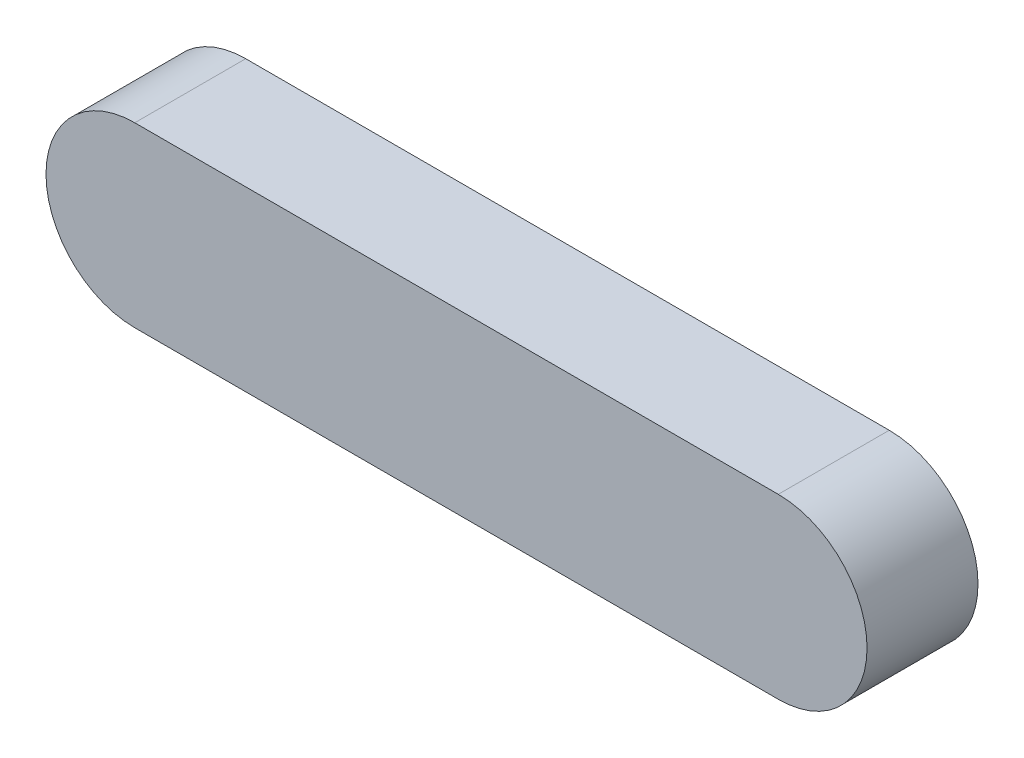
ISO-10303-21;
HEADER;
FILE_DESCRIPTION(('STEP AP214'),'2;1');
FILE_NAME('part.step','',(''),(''),'','','');
FILE_SCHEMA(('AUTOMOTIVE_DESIGN { 1 0 10303 214 1 1 1 1 }'));
ENDSEC;
DATA;
#1=APPLICATION_CONTEXT('core data for automotive mechanical design processes');
#2=APPLICATION_PROTOCOL_DEFINITION('international standard','automotive_design',2000,#1);
#3=PRODUCT_CONTEXT('',#1,'mechanical');
#4=PRODUCT('Part','Part','',(#3));
#5=PRODUCT_RELATED_PRODUCT_CATEGORY('part','',(#4));
#6=PRODUCT_DEFINITION_FORMATION('','',#4);
#7=PRODUCT_DEFINITION_CONTEXT('part definition',#1,'design');
#8=PRODUCT_DEFINITION('design','',#6,#7);
#9=PRODUCT_DEFINITION_SHAPE('','',#8);
#10=(LENGTH_UNIT() NAMED_UNIT(*) SI_UNIT(.MILLI.,.METRE.));
#11=(NAMED_UNIT(*) PLANE_ANGLE_UNIT() SI_UNIT($,.RADIAN.));
#12=(NAMED_UNIT(*) SI_UNIT($,.STERADIAN.) SOLID_ANGLE_UNIT());
#13=UNCERTAINTY_MEASURE_WITH_UNIT(LENGTH_MEASURE(1.E-05),#10,'distance_accuracy_value','');
#14=(GEOMETRIC_REPRESENTATION_CONTEXT(3) GLOBAL_UNCERTAINTY_ASSIGNED_CONTEXT((#13)) GLOBAL_UNIT_ASSIGNED_CONTEXT((#10,
#11,#12)) REPRESENTATION_CONTEXT('',''));
#15=CARTESIAN_POINT('',(0.,0.,0.));
#16=DIRECTION('',(0.,0.,1.));
#17=DIRECTION('',(1.,0.,0.));
#18=AXIS2_PLACEMENT_3D('',#15,#16,#17);
#19=CARTESIAN_POINT('',(0.,0.,10.));
#20=DIRECTION('',(0.,0.,-1.));
#21=DIRECTION('',(-1.,0.,0.));
#22=AXIS2_PLACEMENT_3D('',#19,#20,#21);
#23=CYLINDRICAL_SURFACE('',#22,8.);
#24=CARTESIAN_POINT('',(0.,0.,0.));
#25=DIRECTION('',(0.,0.,1.));
#26=DIRECTION('',(1.,0.,0.));
#27=AXIS2_PLACEMENT_3D('',#24,#25,#26);
#28=CIRCLE('',#27,8.);
#29=CARTESIAN_POINT('',(0.,8.,0.));
#30=VERTEX_POINT('',#29);
#31=CARTESIAN_POINT('',(0.,-8.,0.));
#32=VERTEX_POINT('',#31);
#33=EDGE_CURVE('E111',#30,#32,#28,.T.);
#34=ORIENTED_EDGE('',*,*,#33,.T.);
#35=DIRECTION('',(0.,0.,-1.));
#36=VECTOR('',#35,1.);
#37=CARTESIAN_POINT('',(0.,-8.,10.));
#38=LINE('',#37,#36);
#39=CARTESIAN_POINT('',(0.,-8.,10.));
#40=VERTEX_POINT('',#39);
#41=EDGE_CURVE('E11',#40,#32,#38,.T.);
#42=ORIENTED_EDGE('',*,*,#41,.F.);
#43=CARTESIAN_POINT('',(0.,0.,10.));
#44=DIRECTION('',(0.,0.,1.));
#45=DIRECTION('',(1.,0.,0.));
#46=AXIS2_PLACEMENT_3D('',#43,#44,#45);
#47=CIRCLE('',#46,8.);
#48=CARTESIAN_POINT('',(0.,8.,10.));
#49=VERTEX_POINT('',#48);
#50=EDGE_CURVE('E95',#49,#40,#47,.T.);
#51=ORIENTED_EDGE('',*,*,#50,.F.);
#52=DIRECTION('',(0.,0.,-1.));
#53=VECTOR('',#52,1.);
#54=CARTESIAN_POINT('',(0.,8.,10.));
#55=LINE('',#54,#53);
#56=EDGE_CURVE('E107',#49,#30,#55,.T.);
#57=ORIENTED_EDGE('',*,*,#56,.T.);
#58=EDGE_LOOP('',(#34,#42,#51,#57));
#59=FACE_BOUND('',#58,.T.);
#60=ADVANCED_FACE('F43',(#59),#23,.T.);
#61=CARTESIAN_POINT('',(0.,-8.,10.));
#62=DIRECTION('',(0.,1.,0.));
#63=DIRECTION('',(0.,0.,1.));
#64=AXIS2_PLACEMENT_3D('',#61,#62,#63);
#65=PLANE('',#64);
#66=DIRECTION('',(1.,0.,0.));
#67=VECTOR('',#66,1.);
#68=CARTESIAN_POINT('',(0.,-8.,0.));
#69=LINE('',#68,#67);
#70=CARTESIAN_POINT('',(58.,-8.,0.));
#71=VERTEX_POINT('',#70);
#72=EDGE_CURVE('E100',#32,#71,#69,.T.);
#73=ORIENTED_EDGE('',*,*,#72,.T.);
#74=DIRECTION('',(0.,0.,-1.));
#75=VECTOR('',#74,1.);
#76=CARTESIAN_POINT('',(58.,-8.,10.));
#77=LINE('',#76,#75);
#78=CARTESIAN_POINT('',(58.,-8.,10.));
#79=VERTEX_POINT('',#78);
#80=EDGE_CURVE('E52',#79,#71,#77,.T.);
#81=ORIENTED_EDGE('',*,*,#80,.F.);
#82=DIRECTION('',(1.,0.,0.));
#83=VECTOR('',#82,1.);
#84=CARTESIAN_POINT('',(0.,-8.,10.));
#85=LINE('',#84,#83);
#86=EDGE_CURVE('E90',#40,#79,#85,.T.);
#87=ORIENTED_EDGE('',*,*,#86,.F.);
#88=ORIENTED_EDGE('',*,*,#41,.T.);
#89=EDGE_LOOP('',(#73,#81,#87,#88));
#90=FACE_BOUND('',#89,.T.);
#91=ADVANCED_FACE('F99',(#90),#65,.F.);
#92=CARTESIAN_POINT('',(58.,0.,10.));
#93=DIRECTION('',(0.,0.,-1.));
#94=DIRECTION('',(-1.,0.,0.));
#95=AXIS2_PLACEMENT_3D('',#92,#93,#94);
#96=CYLINDRICAL_SURFACE('',#95,8.);
#97=CARTESIAN_POINT('',(58.,0.,0.));
#98=DIRECTION('',(0.,0.,1.));
#99=DIRECTION('',(1.,0.,0.));
#100=AXIS2_PLACEMENT_3D('',#97,#98,#99);
#101=CIRCLE('',#100,8.);
#102=CARTESIAN_POINT('',(58.,8.,0.));
#103=VERTEX_POINT('',#102);
#104=EDGE_CURVE('E77',#71,#103,#101,.T.);
#105=ORIENTED_EDGE('',*,*,#104,.T.);
#106=DIRECTION('',(0.,0.,-1.));
#107=VECTOR('',#106,1.);
#108=CARTESIAN_POINT('',(58.,8.,10.));
#109=LINE('',#108,#107);
#110=CARTESIAN_POINT('',(58.,8.,10.));
#111=VERTEX_POINT('',#110);
#112=EDGE_CURVE('E102',#111,#103,#109,.T.);
#113=ORIENTED_EDGE('',*,*,#112,.F.);
#114=CARTESIAN_POINT('',(58.,0.,10.));
#115=DIRECTION('',(0.,0.,1.));
#116=DIRECTION('',(1.,0.,0.));
#117=AXIS2_PLACEMENT_3D('',#114,#115,#116);
#118=CIRCLE('',#117,8.);
#119=EDGE_CURVE('E93',#79,#111,#118,.T.);
#120=ORIENTED_EDGE('',*,*,#119,.F.);
#121=ORIENTED_EDGE('',*,*,#80,.T.);
#122=EDGE_LOOP('',(#105,#113,#120,#121));
#123=FACE_BOUND('',#122,.T.);
#124=ADVANCED_FACE('F103',(#123),#96,.T.);
#125=CARTESIAN_POINT('',(0.,8.,10.));
#126=DIRECTION('',(0.,-1.,0.));
#127=DIRECTION('',(0.,0.,-1.));
#128=AXIS2_PLACEMENT_3D('',#125,#126,#127);
#129=PLANE('',#128);
#130=DIRECTION('',(-1.,0.,0.));
#131=VECTOR('',#130,1.);
#132=CARTESIAN_POINT('',(0.,8.,0.));
#133=LINE('',#132,#131);
#134=EDGE_CURVE('E83',#103,#30,#133,.T.);
#135=ORIENTED_EDGE('',*,*,#134,.T.);
#136=ORIENTED_EDGE('',*,*,#56,.F.);
#137=DIRECTION('',(-1.,0.,0.));
#138=VECTOR('',#137,1.);
#139=CARTESIAN_POINT('',(0.,8.,10.));
#140=LINE('',#139,#138);
#141=EDGE_CURVE('E60',#111,#49,#140,.T.);
#142=ORIENTED_EDGE('',*,*,#141,.F.);
#143=ORIENTED_EDGE('',*,*,#112,.T.);
#144=EDGE_LOOP('',(#135,#136,#142,#143));
#145=FACE_BOUND('',#144,.T.);
#146=ADVANCED_FACE('F124',(#145),#129,.F.);
#147=CARTESIAN_POINT('',(0.,0.,10.));
#148=DIRECTION('',(0.,0.,1.));
#149=DIRECTION('',(1.,0.,0.));
#150=AXIS2_PLACEMENT_3D('',#147,#148,#149);
#151=PLANE('',#150);
#152=ORIENTED_EDGE('',*,*,#50,.T.);
#153=ORIENTED_EDGE('',*,*,#86,.T.);
#154=ORIENTED_EDGE('',*,*,#119,.T.);
#155=ORIENTED_EDGE('',*,*,#141,.T.);
#156=EDGE_LOOP('',(#152,#153,#154,#155));
#157=FACE_BOUND('',#156,.T.);
#158=ADVANCED_FACE('F91',(#157),#151,.T.);
#159=CARTESIAN_POINT('',(0.,0.,0.));
#160=DIRECTION('',(0.,0.,1.));
#161=DIRECTION('',(1.,0.,0.));
#162=AXIS2_PLACEMENT_3D('',#159,#160,#161);
#163=PLANE('',#162);
#164=ORIENTED_EDGE('',*,*,#33,.F.);
#165=ORIENTED_EDGE('',*,*,#134,.F.);
#166=ORIENTED_EDGE('',*,*,#104,.F.);
#167=ORIENTED_EDGE('',*,*,#72,.F.);
#168=EDGE_LOOP('',(#164,#165,#166,#167));
#169=FACE_BOUND('',#168,.T.);
#170=ADVANCED_FACE('F127',(#169),#163,.F.);
#171=CLOSED_SHELL('',(#60,#91,#124,#146,#158,#170));
#172=MANIFOLD_SOLID_BREP('B2',#171);
#173=ADVANCED_BREP_SHAPE_REPRESENTATION('',(#18,#172),#14);
#174=SHAPE_DEFINITION_REPRESENTATION(#9,#173);
ENDSEC;
END-ISO-10303-21;
